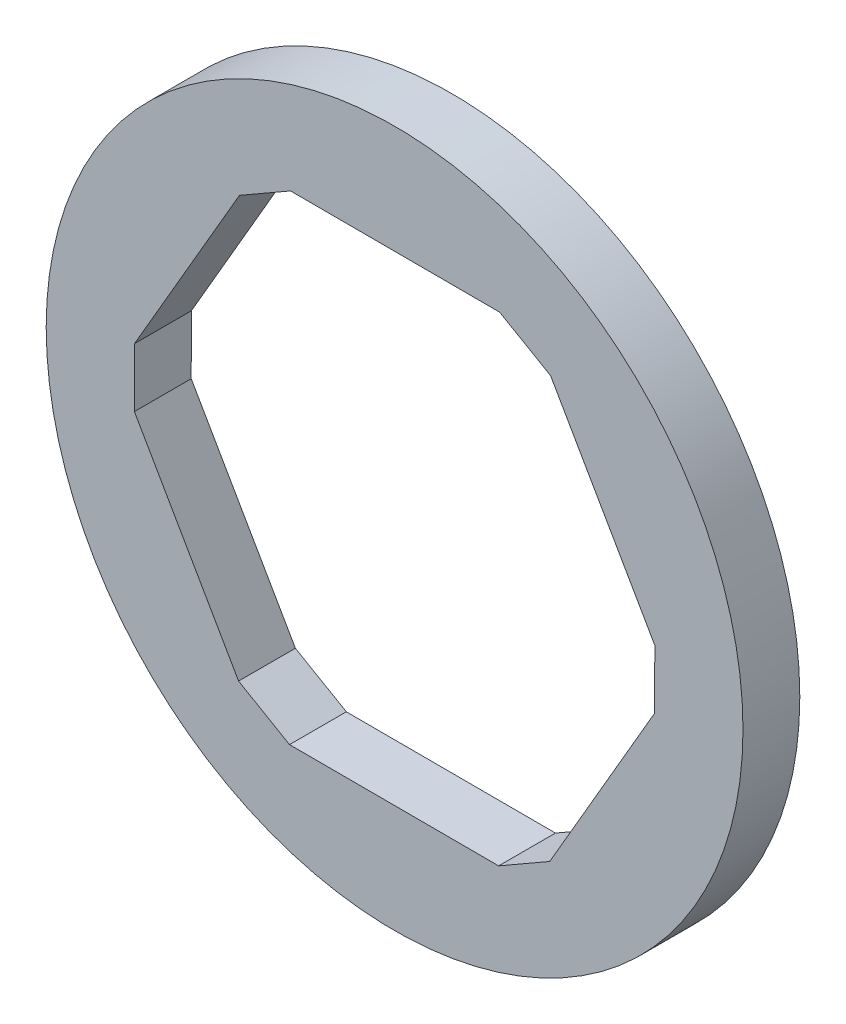
ISO-10303-21;
HEADER;
FILE_DESCRIPTION(('STEP AP214'),'2;1');
FILE_NAME('part.step','',(''),(''),'','','');
FILE_SCHEMA(('AUTOMOTIVE_DESIGN { 1 0 10303 214 1 1 1 1 }'));
ENDSEC;
DATA;
#1=APPLICATION_CONTEXT('core data for automotive mechanical design processes');
#2=APPLICATION_PROTOCOL_DEFINITION('international standard','automotive_design',2000,#1);
#3=PRODUCT_CONTEXT('',#1,'mechanical');
#4=PRODUCT('Part','Part','',(#3));
#5=PRODUCT_RELATED_PRODUCT_CATEGORY('part','',(#4));
#6=PRODUCT_DEFINITION_FORMATION('','',#4);
#7=PRODUCT_DEFINITION_CONTEXT('part definition',#1,'design');
#8=PRODUCT_DEFINITION('design','',#6,#7);
#9=PRODUCT_DEFINITION_SHAPE('','',#8);
#10=(LENGTH_UNIT() NAMED_UNIT(*) SI_UNIT(.MILLI.,.METRE.));
#11=(NAMED_UNIT(*) PLANE_ANGLE_UNIT() SI_UNIT($,.RADIAN.));
#12=(NAMED_UNIT(*) SI_UNIT($,.STERADIAN.) SOLID_ANGLE_UNIT());
#13=UNCERTAINTY_MEASURE_WITH_UNIT(LENGTH_MEASURE(1.E-05),#10,'distance_accuracy_value','');
#14=(GEOMETRIC_REPRESENTATION_CONTEXT(3) GLOBAL_UNCERTAINTY_ASSIGNED_CONTEXT((#13)) GLOBAL_UNIT_ASSIGNED_CONTEXT((#10,
#11,#12)) REPRESENTATION_CONTEXT('',''));
#15=CARTESIAN_POINT('',(0.,0.,0.));
#16=DIRECTION('',(0.,0.,1.));
#17=DIRECTION('',(1.,0.,0.));
#18=AXIS2_PLACEMENT_3D('',#15,#16,#17);
#19=CARTESIAN_POINT('',(0.,0.,1.5113));
#20=DIRECTION('',(0.,0.,1.));
#21=DIRECTION('',(1.,0.,0.));
#22=AXIS2_PLACEMENT_3D('',#19,#20,#21);
#23=PLANE('',#22);
#24=CARTESIAN_POINT('',(0.,0.,1.5113));
#25=DIRECTION('',(0.,0.,1.));
#26=DIRECTION('',(1.,0.,0.));
#27=AXIS2_PLACEMENT_3D('',#24,#25,#26);
#28=CIRCLE('',#27,9.26675750093145);
#29=CARTESIAN_POINT('',(9.26675750093145,0.,1.5113));
#30=VERTEX_POINT('',#29);
#31=EDGE_CURVE('E11',#30,#30,#28,.T.);
#32=ORIENTED_EDGE('',*,*,#31,.T.);
#33=EDGE_LOOP('',(#32));
#34=FACE_BOUND('',#33,.T.);
#35=DIRECTION('',(-0.867098131953429,-0.498137360135609,0.));
#36=VECTOR('',#35,1.);
#37=CARTESIAN_POINT('',(-2.76740923459767,6.38944280980686,1.5113));
#38=LINE('',#37,#36);
#39=CARTESIAN_POINT('',(-2.76740923459767,6.38944280980686,1.5113));
#40=VERTEX_POINT('',#39);
#41=CARTESIAN_POINT('',(-4.12564006629193,5.60915567041385,1.5113));
#42=VERTEX_POINT('',#41);
#43=EDGE_CURVE('E134',#40,#42,#38,.T.);
#44=ORIENTED_EDGE('',*,*,#43,.F.);
#45=DIRECTION('',(-0.999997689913506,0.0021494575251605,0.));
#46=VECTOR('',#45,1.);
#47=CARTESIAN_POINT('',(2.79485127121397,6.37748693948665,1.5113));
#48=LINE('',#47,#46);
#49=CARTESIAN_POINT('',(2.79485127121397,6.37748693948665,1.5113));
#50=VERTEX_POINT('',#49);
#51=EDGE_CURVE('E126',#50,#40,#48,.T.);
#52=ORIENTED_EDGE('',*,*,#51,.F.);
#53=DIRECTION('',(-0.864948674428269,0.501860329777898,0.));
#54=VECTOR('',#53,1.);
#55=CARTESIAN_POINT('',(4.14971517202173,5.59136810473267,1.5113));
#56=LINE('',#55,#54);
#57=CARTESIAN_POINT('',(4.14971517202173,5.59136810473267,1.5113));
#58=VERTEX_POINT('',#57);
#59=EDGE_CURVE('E166',#58,#50,#56,.T.);
#60=ORIENTED_EDGE('',*,*,#59,.F.);
#61=DIRECTION('',(-0.498137360135608,0.86709813195343,0.));
#62=VECTOR('',#61,1.);
#63=CARTESIAN_POINT('',(6.92049133750589,0.768331269072801,1.5113));
#64=LINE('',#63,#62);
#65=CARTESIAN_POINT('',(6.92049133750589,0.768331269072801,1.5113));
#66=VERTEX_POINT('',#65);
#67=EDGE_CURVE('E164',#66,#58,#64,.T.);
#68=ORIENTED_EDGE('',*,*,#67,.F.);
#69=DIRECTION('',(0.00214945752516037,0.999997689913506,0.));
#70=VECTOR('',#69,1.);
#71=CARTESIAN_POINT('',(6.91712440661941,-0.798074705074196,1.5113));
#72=LINE('',#71,#70);
#73=CARTESIAN_POINT('',(6.91712440661941,-0.798074705074196,1.5113));
#74=VERTEX_POINT('',#73);
#75=EDGE_CURVE('E162',#74,#66,#72,.T.);
#76=ORIENTED_EDGE('',*,*,#75,.F.);
#77=DIRECTION('',(0.501860329777897,0.864948674428269,0.));
#78=VECTOR('',#77,1.);
#79=CARTESIAN_POINT('',(4.12564006629192,-5.60915567041386,1.5113));
#80=LINE('',#79,#78);
#81=CARTESIAN_POINT('',(4.12564006629192,-5.60915567041386,1.5113));
#82=VERTEX_POINT('',#81);
#83=EDGE_CURVE('E160',#82,#74,#80,.T.);
#84=ORIENTED_EDGE('',*,*,#83,.F.);
#85=DIRECTION('',(0.86709813195343,0.498137360135608,0.));
#86=VECTOR('',#85,1.);
#87=CARTESIAN_POINT('',(2.76740923459767,-6.38944280980687,1.5113));
#88=LINE('',#87,#86);
#89=CARTESIAN_POINT('',(2.76740923459767,-6.38944280980687,1.5113));
#90=VERTEX_POINT('',#89);
#91=EDGE_CURVE('E158',#90,#82,#88,.T.);
#92=ORIENTED_EDGE('',*,*,#91,.F.);
#93=DIRECTION('',(0.999997689913506,-0.00214945752516082,0.));
#94=VECTOR('',#93,1.);
#95=CARTESIAN_POINT('',(-2.79485127121397,-6.37748693948665,1.5113));
#96=LINE('',#95,#94);
#97=CARTESIAN_POINT('',(-2.79485127121397,-6.37748693948665,1.5113));
#98=VERTEX_POINT('',#97);
#99=EDGE_CURVE('E156',#98,#90,#96,.T.);
#100=ORIENTED_EDGE('',*,*,#99,.F.);
#101=DIRECTION('',(0.86494867442827,-0.501860329777896,0.));
#102=VECTOR('',#101,1.);
#103=CARTESIAN_POINT('',(-4.14971517202173,-5.59136810473267,1.5113));
#104=LINE('',#103,#102);
#105=CARTESIAN_POINT('',(-4.14971517202173,-5.59136810473267,1.5113));
#106=VERTEX_POINT('',#105);
#107=EDGE_CURVE('E154',#106,#98,#104,.T.);
#108=ORIENTED_EDGE('',*,*,#107,.F.);
#109=DIRECTION('',(0.498137360135608,-0.86709813195343,0.));
#110=VECTOR('',#109,1.);
#111=CARTESIAN_POINT('',(-6.92049133750589,-0.768331269072805,1.5113));
#112=LINE('',#111,#110);
#113=CARTESIAN_POINT('',(-6.92049133750589,-0.768331269072805,1.5113));
#114=VERTEX_POINT('',#113);
#115=EDGE_CURVE('E152',#114,#106,#112,.T.);
#116=ORIENTED_EDGE('',*,*,#115,.F.);
#117=DIRECTION('',(-0.00214945752516037,-0.999997689913505,0.));
#118=VECTOR('',#117,1.);
#119=CARTESIAN_POINT('',(-6.91712440661941,0.798074705074193,1.5113));
#120=LINE('',#119,#118);
#121=CARTESIAN_POINT('',(-6.91712440661941,0.798074705074193,1.5113));
#122=VERTEX_POINT('',#121);
#123=EDGE_CURVE('E148',#122,#114,#120,.T.);
#124=ORIENTED_EDGE('',*,*,#123,.F.);
#125=DIRECTION('',(-0.501860329777897,-0.864948674428269,0.));
#126=VECTOR('',#125,1.);
#127=CARTESIAN_POINT('',(-4.12564006629193,5.60915567041385,1.5113));
#128=LINE('',#127,#126);
#129=EDGE_CURVE('E146',#42,#122,#128,.T.);
#130=ORIENTED_EDGE('',*,*,#129,.F.);
#131=EDGE_LOOP('',(#44,#52,#60,#68,#76,#84,#92,#100,#108,#116,#124,#130));
#132=FACE_BOUND('',#131,.T.);
#133=ADVANCED_FACE('F37',(#34,#132),#23,.T.);
#134=CARTESIAN_POINT('',(0.,0.,0.));
#135=DIRECTION('',(0.,0.,1.));
#136=DIRECTION('',(1.,0.,0.));
#137=AXIS2_PLACEMENT_3D('',#134,#135,#136);
#138=PLANE('',#137);
#139=CARTESIAN_POINT('',(0.,0.,0.));
#140=DIRECTION('',(0.,0.,1.));
#141=DIRECTION('',(1.,0.,0.));
#142=AXIS2_PLACEMENT_3D('',#139,#140,#141);
#143=CIRCLE('',#142,9.26675750093145);
#144=CARTESIAN_POINT('',(9.26675750093145,0.,0.));
#145=VERTEX_POINT('',#144);
#146=EDGE_CURVE('E41',#145,#145,#143,.T.);
#147=ORIENTED_EDGE('',*,*,#146,.F.);
#148=EDGE_LOOP('',(#147));
#149=FACE_BOUND('',#148,.T.);
#150=DIRECTION('',(-0.999997689913506,0.0021494575251605,0.));
#151=VECTOR('',#150,1.);
#152=CARTESIAN_POINT('',(2.79485127121397,6.37748693948665,0.));
#153=LINE('',#152,#151);
#154=CARTESIAN_POINT('',(2.79485127121397,6.37748693948665,0.));
#155=VERTEX_POINT('',#154);
#156=CARTESIAN_POINT('',(-2.76740923459767,6.38944280980686,0.));
#157=VERTEX_POINT('',#156);
#158=EDGE_CURVE('E60',#155,#157,#153,.T.);
#159=ORIENTED_EDGE('',*,*,#158,.T.);
#160=DIRECTION('',(-0.867098131953429,-0.498137360135609,0.));
#161=VECTOR('',#160,1.);
#162=CARTESIAN_POINT('',(-2.76740923459767,6.38944280980686,0.));
#163=LINE('',#162,#161);
#164=CARTESIAN_POINT('',(-4.12564006629193,5.60915567041385,0.));
#165=VERTEX_POINT('',#164);
#166=EDGE_CURVE('E141',#157,#165,#163,.T.);
#167=ORIENTED_EDGE('',*,*,#166,.T.);
#168=DIRECTION('',(-0.501860329777897,-0.864948674428269,0.));
#169=VECTOR('',#168,1.);
#170=CARTESIAN_POINT('',(-4.12564006629193,5.60915567041385,0.));
#171=LINE('',#170,#169);
#172=CARTESIAN_POINT('',(-6.91712440661941,0.798074705074193,0.));
#173=VERTEX_POINT('',#172);
#174=EDGE_CURVE('E170',#165,#173,#171,.T.);
#175=ORIENTED_EDGE('',*,*,#174,.T.);
#176=DIRECTION('',(-0.00214945752516037,-0.999997689913505,0.));
#177=VECTOR('',#176,1.);
#178=CARTESIAN_POINT('',(-6.91712440661941,0.798074705074193,0.));
#179=LINE('',#178,#177);
#180=CARTESIAN_POINT('',(-6.92049133750589,-0.768331269072805,0.));
#181=VERTEX_POINT('',#180);
#182=EDGE_CURVE('E173',#173,#181,#179,.T.);
#183=ORIENTED_EDGE('',*,*,#182,.T.);
#184=DIRECTION('',(0.498137360135608,-0.86709813195343,0.));
#185=VECTOR('',#184,1.);
#186=CARTESIAN_POINT('',(-6.92049133750589,-0.768331269072805,0.));
#187=LINE('',#186,#185);
#188=CARTESIAN_POINT('',(-4.14971517202173,-5.59136810473267,0.));
#189=VERTEX_POINT('',#188);
#190=EDGE_CURVE('E176',#181,#189,#187,.T.);
#191=ORIENTED_EDGE('',*,*,#190,.T.);
#192=DIRECTION('',(0.86494867442827,-0.501860329777896,0.));
#193=VECTOR('',#192,1.);
#194=CARTESIAN_POINT('',(-4.14971517202173,-5.59136810473267,0.));
#195=LINE('',#194,#193);
#196=CARTESIAN_POINT('',(-2.79485127121397,-6.37748693948665,0.));
#197=VERTEX_POINT('',#196);
#198=EDGE_CURVE('E179',#189,#197,#195,.T.);
#199=ORIENTED_EDGE('',*,*,#198,.T.);
#200=DIRECTION('',(0.999997689913506,-0.00214945752516082,0.));
#201=VECTOR('',#200,1.);
#202=CARTESIAN_POINT('',(-2.79485127121397,-6.37748693948665,0.));
#203=LINE('',#202,#201);
#204=CARTESIAN_POINT('',(2.76740923459767,-6.38944280980687,0.));
#205=VERTEX_POINT('',#204);
#206=EDGE_CURVE('E182',#197,#205,#203,.T.);
#207=ORIENTED_EDGE('',*,*,#206,.T.);
#208=DIRECTION('',(0.86709813195343,0.498137360135608,0.));
#209=VECTOR('',#208,1.);
#210=CARTESIAN_POINT('',(2.76740923459767,-6.38944280980687,0.));
#211=LINE('',#210,#209);
#212=CARTESIAN_POINT('',(4.12564006629192,-5.60915567041386,0.));
#213=VERTEX_POINT('',#212);
#214=EDGE_CURVE('E185',#205,#213,#211,.T.);
#215=ORIENTED_EDGE('',*,*,#214,.T.);
#216=DIRECTION('',(0.501860329777897,0.864948674428269,0.));
#217=VECTOR('',#216,1.);
#218=CARTESIAN_POINT('',(4.12564006629192,-5.60915567041386,0.));
#219=LINE('',#218,#217);
#220=CARTESIAN_POINT('',(6.91712440661941,-0.798074705074196,0.));
#221=VERTEX_POINT('',#220);
#222=EDGE_CURVE('E188',#213,#221,#219,.T.);
#223=ORIENTED_EDGE('',*,*,#222,.T.);
#224=DIRECTION('',(0.00214945752516037,0.999997689913506,0.));
#225=VECTOR('',#224,1.);
#226=CARTESIAN_POINT('',(6.91712440661941,-0.798074705074196,0.));
#227=LINE('',#226,#225);
#228=CARTESIAN_POINT('',(6.92049133750589,0.768331269072801,0.));
#229=VERTEX_POINT('',#228);
#230=EDGE_CURVE('E191',#221,#229,#227,.T.);
#231=ORIENTED_EDGE('',*,*,#230,.T.);
#232=DIRECTION('',(-0.498137360135608,0.86709813195343,0.));
#233=VECTOR('',#232,1.);
#234=CARTESIAN_POINT('',(6.92049133750589,0.768331269072801,0.));
#235=LINE('',#234,#233);
#236=CARTESIAN_POINT('',(4.14971517202173,5.59136810473267,0.));
#237=VERTEX_POINT('',#236);
#238=EDGE_CURVE('E194',#229,#237,#235,.T.);
#239=ORIENTED_EDGE('',*,*,#238,.T.);
#240=DIRECTION('',(-0.864948674428269,0.501860329777898,0.));
#241=VECTOR('',#240,1.);
#242=CARTESIAN_POINT('',(4.14971517202173,5.59136810473267,0.));
#243=LINE('',#242,#241);
#244=EDGE_CURVE('E135',#237,#155,#243,.T.);
#245=ORIENTED_EDGE('',*,*,#244,.T.);
#246=EDGE_LOOP('',(#159,#167,#175,#183,#191,#199,#207,#215,#223,#231,#239,#245));
#247=FACE_BOUND('',#246,.T.);
#248=ADVANCED_FACE('F223',(#149,#247),#138,.F.);
#249=CARTESIAN_POINT('',(0.,0.,1.5113));
#250=DIRECTION('',(0.,0.,-1.));
#251=DIRECTION('',(-1.,0.,0.));
#252=AXIS2_PLACEMENT_3D('',#249,#250,#251);
#253=CYLINDRICAL_SURFACE('',#252,9.26675750093145);
#254=ORIENTED_EDGE('',*,*,#31,.F.);
#255=EDGE_LOOP('',(#254));
#256=FACE_BOUND('',#255,.T.);
#257=ORIENTED_EDGE('',*,*,#146,.T.);
#258=EDGE_LOOP('',(#257));
#259=FACE_BOUND('',#258,.T.);
#260=ADVANCED_FACE('F39',(#256,#259),#253,.T.);
#261=CARTESIAN_POINT('',(2.79485127121397,6.37748693948665,1.5113));
#262=DIRECTION('',(-0.0021494575251605,-0.999997689913506,0.));
#263=DIRECTION('',(0.999997689913506,-0.0021494575251605,0.));
#264=AXIS2_PLACEMENT_3D('',#261,#262,#263);
#265=PLANE('',#264);
#266=ORIENTED_EDGE('',*,*,#158,.F.);
#267=DIRECTION('',(0.,0.,-1.));
#268=VECTOR('',#267,1.);
#269=CARTESIAN_POINT('',(2.79485127121397,6.37748693948665,1.5113));
#270=LINE('',#269,#268);
#271=EDGE_CURVE('E130',#50,#155,#270,.T.);
#272=ORIENTED_EDGE('',*,*,#271,.F.);
#273=ORIENTED_EDGE('',*,*,#51,.T.);
#274=DIRECTION('',(0.,0.,-1.));
#275=VECTOR('',#274,1.);
#276=CARTESIAN_POINT('',(-2.76740923459767,6.38944280980686,1.5113));
#277=LINE('',#276,#275);
#278=EDGE_CURVE('E129',#40,#157,#277,.T.);
#279=ORIENTED_EDGE('',*,*,#278,.T.);
#280=EDGE_LOOP('',(#266,#272,#273,#279));
#281=FACE_BOUND('',#280,.T.);
#282=ADVANCED_FACE('F128',(#281),#265,.T.);
#283=CARTESIAN_POINT('',(-2.76740923459767,6.38944280980686,1.5113));
#284=DIRECTION('',(0.498137360135609,-0.867098131953429,0.));
#285=DIRECTION('',(0.867098131953429,0.498137360135609,0.));
#286=AXIS2_PLACEMENT_3D('',#283,#284,#285);
#287=PLANE('',#286);
#288=ORIENTED_EDGE('',*,*,#166,.F.);
#289=ORIENTED_EDGE('',*,*,#278,.F.);
#290=ORIENTED_EDGE('',*,*,#43,.T.);
#291=DIRECTION('',(0.,0.,-1.));
#292=VECTOR('',#291,1.);
#293=CARTESIAN_POINT('',(-4.12564006629193,5.60915567041385,1.5113));
#294=LINE('',#293,#292);
#295=EDGE_CURVE('E142',#42,#165,#294,.T.);
#296=ORIENTED_EDGE('',*,*,#295,.T.);
#297=EDGE_LOOP('',(#288,#289,#290,#296));
#298=FACE_BOUND('',#297,.T.);
#299=ADVANCED_FACE('F138',(#298),#287,.T.);
#300=CARTESIAN_POINT('',(-4.12564006629193,5.60915567041385,1.5113));
#301=DIRECTION('',(0.864948674428269,-0.501860329777897,0.));
#302=DIRECTION('',(0.501860329777897,0.86494867442827,0.));
#303=AXIS2_PLACEMENT_3D('',#300,#301,#302);
#304=PLANE('',#303);
#305=ORIENTED_EDGE('',*,*,#174,.F.);
#306=ORIENTED_EDGE('',*,*,#295,.F.);
#307=ORIENTED_EDGE('',*,*,#129,.T.);
#308=DIRECTION('',(0.,0.,-1.));
#309=VECTOR('',#308,1.);
#310=CARTESIAN_POINT('',(-6.91712440661941,0.798074705074193,1.5113));
#311=LINE('',#310,#309);
#312=EDGE_CURVE('E215',#122,#173,#311,.T.);
#313=ORIENTED_EDGE('',*,*,#312,.T.);
#314=EDGE_LOOP('',(#305,#306,#307,#313));
#315=FACE_BOUND('',#314,.T.);
#316=ADVANCED_FACE('F219',(#315),#304,.T.);
#317=CARTESIAN_POINT('',(-6.91712440661941,0.798074705074193,1.5113));
#318=DIRECTION('',(0.999997689913505,-0.00214945752516037,0.));
#319=DIRECTION('',(0.00214945752516037,0.999997689913506,0.));
#320=AXIS2_PLACEMENT_3D('',#317,#318,#319);
#321=PLANE('',#320);
#322=ORIENTED_EDGE('',*,*,#182,.F.);
#323=ORIENTED_EDGE('',*,*,#312,.F.);
#324=ORIENTED_EDGE('',*,*,#123,.T.);
#325=DIRECTION('',(0.,0.,-1.));
#326=VECTOR('',#325,1.);
#327=CARTESIAN_POINT('',(-6.92049133750589,-0.768331269072805,1.5113));
#328=LINE('',#327,#326);
#329=EDGE_CURVE('E213',#114,#181,#328,.T.);
#330=ORIENTED_EDGE('',*,*,#329,.T.);
#331=EDGE_LOOP('',(#322,#323,#324,#330));
#332=FACE_BOUND('',#331,.T.);
#333=ADVANCED_FACE('F261',(#332),#321,.T.);
#334=CARTESIAN_POINT('',(-6.92049133750589,-0.768331269072805,1.5113));
#335=DIRECTION('',(0.86709813195343,0.498137360135608,0.));
#336=DIRECTION('',(-0.498137360135608,0.86709813195343,0.));
#337=AXIS2_PLACEMENT_3D('',#334,#335,#336);
#338=PLANE('',#337);
#339=ORIENTED_EDGE('',*,*,#190,.F.);
#340=ORIENTED_EDGE('',*,*,#329,.F.);
#341=ORIENTED_EDGE('',*,*,#115,.T.);
#342=DIRECTION('',(0.,0.,-1.));
#343=VECTOR('',#342,1.);
#344=CARTESIAN_POINT('',(-4.14971517202173,-5.59136810473267,1.5113));
#345=LINE('',#344,#343);
#346=EDGE_CURVE('E211',#106,#189,#345,.T.);
#347=ORIENTED_EDGE('',*,*,#346,.T.);
#348=EDGE_LOOP('',(#339,#340,#341,#347));
#349=FACE_BOUND('',#348,.T.);
#350=ADVANCED_FACE('F259',(#349),#338,.T.);
#351=CARTESIAN_POINT('',(-4.14971517202173,-5.59136810473267,1.5113));
#352=DIRECTION('',(0.501860329777897,0.86494867442827,0.));
#353=DIRECTION('',(-0.86494867442827,0.501860329777897,0.));
#354=AXIS2_PLACEMENT_3D('',#351,#352,#353);
#355=PLANE('',#354);
#356=ORIENTED_EDGE('',*,*,#198,.F.);
#357=ORIENTED_EDGE('',*,*,#346,.F.);
#358=ORIENTED_EDGE('',*,*,#107,.T.);
#359=DIRECTION('',(0.,0.,-1.));
#360=VECTOR('',#359,1.);
#361=CARTESIAN_POINT('',(-2.79485127121397,-6.37748693948665,1.5113));
#362=LINE('',#361,#360);
#363=EDGE_CURVE('E209',#98,#197,#362,.T.);
#364=ORIENTED_EDGE('',*,*,#363,.T.);
#365=EDGE_LOOP('',(#356,#357,#358,#364));
#366=FACE_BOUND('',#365,.T.);
#367=ADVANCED_FACE('F253',(#366),#355,.T.);
#368=CARTESIAN_POINT('',(-2.79485127121397,-6.37748693948665,1.5113));
#369=DIRECTION('',(0.00214945752516082,0.999997689913506,0.));
#370=DIRECTION('',(-0.999997689913506,0.00214945752516082,0.));
#371=AXIS2_PLACEMENT_3D('',#368,#369,#370);
#372=PLANE('',#371);
#373=ORIENTED_EDGE('',*,*,#206,.F.);
#374=ORIENTED_EDGE('',*,*,#363,.F.);
#375=ORIENTED_EDGE('',*,*,#99,.T.);
#376=DIRECTION('',(0.,0.,-1.));
#377=VECTOR('',#376,1.);
#378=CARTESIAN_POINT('',(2.76740923459767,-6.38944280980687,1.5113));
#379=LINE('',#378,#377);
#380=EDGE_CURVE('E207',#90,#205,#379,.T.);
#381=ORIENTED_EDGE('',*,*,#380,.T.);
#382=EDGE_LOOP('',(#373,#374,#375,#381));
#383=FACE_BOUND('',#382,.T.);
#384=ADVANCED_FACE('F249',(#383),#372,.T.);
#385=CARTESIAN_POINT('',(2.76740923459767,-6.38944280980687,1.5113));
#386=DIRECTION('',(-0.498137360135608,0.86709813195343,0.));
#387=DIRECTION('',(-0.86709813195343,-0.498137360135608,0.));
#388=AXIS2_PLACEMENT_3D('',#385,#386,#387);
#389=PLANE('',#388);
#390=ORIENTED_EDGE('',*,*,#214,.F.);
#391=ORIENTED_EDGE('',*,*,#380,.F.);
#392=ORIENTED_EDGE('',*,*,#91,.T.);
#393=DIRECTION('',(0.,0.,-1.));
#394=VECTOR('',#393,1.);
#395=CARTESIAN_POINT('',(4.12564006629192,-5.60915567041386,1.5113));
#396=LINE('',#395,#394);
#397=EDGE_CURVE('E205',#82,#213,#396,.T.);
#398=ORIENTED_EDGE('',*,*,#397,.T.);
#399=EDGE_LOOP('',(#390,#391,#392,#398));
#400=FACE_BOUND('',#399,.T.);
#401=ADVANCED_FACE('F246',(#400),#389,.T.);
#402=CARTESIAN_POINT('',(4.12564006629192,-5.60915567041386,1.5113));
#403=DIRECTION('',(-0.864948674428269,0.501860329777897,0.));
#404=DIRECTION('',(-0.501860329777898,-0.864948674428269,0.));
#405=AXIS2_PLACEMENT_3D('',#402,#403,#404);
#406=PLANE('',#405);
#407=ORIENTED_EDGE('',*,*,#222,.F.);
#408=ORIENTED_EDGE('',*,*,#397,.F.);
#409=ORIENTED_EDGE('',*,*,#83,.T.);
#410=DIRECTION('',(0.,0.,-1.));
#411=VECTOR('',#410,1.);
#412=CARTESIAN_POINT('',(6.91712440661941,-0.798074705074196,1.5113));
#413=LINE('',#412,#411);
#414=EDGE_CURVE('E203',#74,#221,#413,.T.);
#415=ORIENTED_EDGE('',*,*,#414,.T.);
#416=EDGE_LOOP('',(#407,#408,#409,#415));
#417=FACE_BOUND('',#416,.T.);
#418=ADVANCED_FACE('F238',(#417),#406,.T.);
#419=CARTESIAN_POINT('',(6.91712440661941,-0.798074705074196,1.5113));
#420=DIRECTION('',(-0.999997689913506,0.00214945752516037,0.));
#421=DIRECTION('',(-0.00214945752516037,-0.999997689913506,0.));
#422=AXIS2_PLACEMENT_3D('',#419,#420,#421);
#423=PLANE('',#422);
#424=ORIENTED_EDGE('',*,*,#230,.F.);
#425=ORIENTED_EDGE('',*,*,#414,.F.);
#426=ORIENTED_EDGE('',*,*,#75,.T.);
#427=DIRECTION('',(0.,0.,-1.));
#428=VECTOR('',#427,1.);
#429=CARTESIAN_POINT('',(6.92049133750589,0.768331269072801,1.5113));
#430=LINE('',#429,#428);
#431=EDGE_CURVE('E201',#66,#229,#430,.T.);
#432=ORIENTED_EDGE('',*,*,#431,.T.);
#433=EDGE_LOOP('',(#424,#425,#426,#432));
#434=FACE_BOUND('',#433,.T.);
#435=ADVANCED_FACE('F234',(#434),#423,.T.);
#436=CARTESIAN_POINT('',(6.92049133750589,0.768331269072801,1.5113));
#437=DIRECTION('',(-0.86709813195343,-0.498137360135608,0.));
#438=DIRECTION('',(0.498137360135608,-0.86709813195343,0.));
#439=AXIS2_PLACEMENT_3D('',#436,#437,#438);
#440=PLANE('',#439);
#441=ORIENTED_EDGE('',*,*,#238,.F.);
#442=ORIENTED_EDGE('',*,*,#431,.F.);
#443=ORIENTED_EDGE('',*,*,#67,.T.);
#444=DIRECTION('',(0.,0.,-1.));
#445=VECTOR('',#444,1.);
#446=CARTESIAN_POINT('',(4.14971517202173,5.59136810473267,1.5113));
#447=LINE('',#446,#445);
#448=EDGE_CURVE('E52',#58,#237,#447,.T.);
#449=ORIENTED_EDGE('',*,*,#448,.T.);
#450=EDGE_LOOP('',(#441,#442,#443,#449));
#451=FACE_BOUND('',#450,.T.);
#452=ADVANCED_FACE('F231',(#451),#440,.T.);
#453=CARTESIAN_POINT('',(4.14971517202173,5.59136810473267,1.5113));
#454=DIRECTION('',(-0.501860329777898,-0.864948674428269,0.));
#455=DIRECTION('',(0.864948674428269,-0.501860329777898,0.));
#456=AXIS2_PLACEMENT_3D('',#453,#454,#455);
#457=PLANE('',#456);
#458=ORIENTED_EDGE('',*,*,#244,.F.);
#459=ORIENTED_EDGE('',*,*,#448,.F.);
#460=ORIENTED_EDGE('',*,*,#59,.T.);
#461=ORIENTED_EDGE('',*,*,#271,.T.);
#462=EDGE_LOOP('',(#458,#459,#460,#461));
#463=FACE_BOUND('',#462,.T.);
#464=ADVANCED_FACE('F225',(#463),#457,.T.);
#465=CLOSED_SHELL('',(#133,#248,#260,#282,#299,#316,#333,#350,#367,#384,#401,#418,#435,#452,#464));
#466=MANIFOLD_SOLID_BREP('B2',#465);
#467=ADVANCED_BREP_SHAPE_REPRESENTATION('',(#18,#466),#14);
#468=SHAPE_DEFINITION_REPRESENTATION(#9,#467);
ENDSEC;
END-ISO-10303-21;
